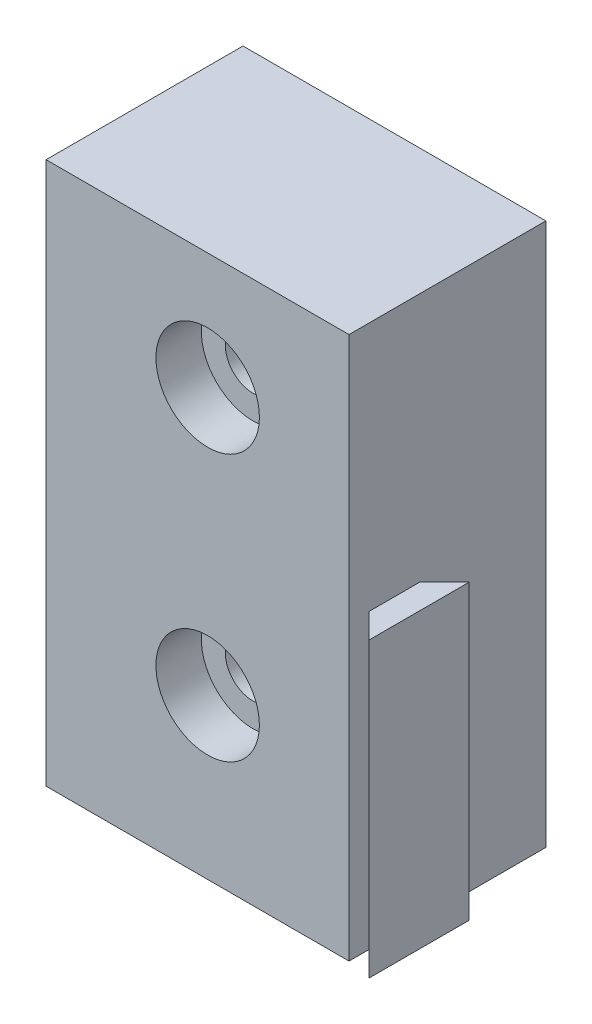
ISO-10303-21;
HEADER;
FILE_DESCRIPTION(('STEP AP214'),'2;1');
FILE_NAME('part.step','',(''),(''),'','','');
FILE_SCHEMA(('AUTOMOTIVE_DESIGN { 1 0 10303 214 1 1 1 1 }'));
ENDSEC;
DATA;
#1=APPLICATION_CONTEXT('core data for automotive mechanical design processes');
#2=APPLICATION_PROTOCOL_DEFINITION('international standard','automotive_design',2000,#1);
#3=PRODUCT_CONTEXT('',#1,'mechanical');
#4=PRODUCT('Part','Part','',(#3));
#5=PRODUCT_RELATED_PRODUCT_CATEGORY('part','',(#4));
#6=PRODUCT_DEFINITION_FORMATION('','',#4);
#7=PRODUCT_DEFINITION_CONTEXT('part definition',#1,'design');
#8=PRODUCT_DEFINITION('design','',#6,#7);
#9=PRODUCT_DEFINITION_SHAPE('','',#8);
#10=(LENGTH_UNIT() NAMED_UNIT(*) SI_UNIT(.MILLI.,.METRE.));
#11=(NAMED_UNIT(*) PLANE_ANGLE_UNIT() SI_UNIT($,.RADIAN.));
#12=(NAMED_UNIT(*) SI_UNIT($,.STERADIAN.) SOLID_ANGLE_UNIT());
#13=UNCERTAINTY_MEASURE_WITH_UNIT(LENGTH_MEASURE(1.E-05),#10,'distance_accuracy_value','');
#14=(GEOMETRIC_REPRESENTATION_CONTEXT(3) GLOBAL_UNCERTAINTY_ASSIGNED_CONTEXT((#13)) GLOBAL_UNIT_ASSIGNED_CONTEXT((#10,
#11,#12)) REPRESENTATION_CONTEXT('',''));
#15=CARTESIAN_POINT('',(0.,0.,0.));
#16=DIRECTION('',(0.,0.,1.));
#17=DIRECTION('',(1.,0.,0.));
#18=AXIS2_PLACEMENT_3D('',#15,#16,#17);
#19=CARTESIAN_POINT('',(0.,15.2522729151325,-63.4));
#20=DIRECTION('',(1.,0.,0.));
#21=DIRECTION('',(0.,0.,-1.));
#22=AXIS2_PLACEMENT_3D('',#19,#20,#21);
#23=PLANE('',#22);
#24=DIRECTION('',(0.,-1.,0.));
#25=VECTOR('',#24,1.);
#26=CARTESIAN_POINT('',(0.,29.,-45.8992173403571));
#27=LINE('',#26,#25);
#28=CARTESIAN_POINT('',(0.,29.,-45.8992173403571));
#29=VERTEX_POINT('',#28);
#30=CARTESIAN_POINT('',(0.,0.,-45.8992173403571));
#31=VERTEX_POINT('',#30);
#32=EDGE_CURVE('E195',#29,#31,#27,.T.);
#33=ORIENTED_EDGE('',*,*,#32,.F.);
#34=DIRECTION('',(0.,0.,1.));
#35=VECTOR('',#34,1.);
#36=CARTESIAN_POINT('',(0.,29.,-50.8992173403571));
#37=LINE('',#36,#35);
#38=CARTESIAN_POINT('',(0.,29.,-50.8992173403571));
#39=VERTEX_POINT('',#38);
#40=EDGE_CURVE('E199',#39,#29,#37,.T.);
#41=ORIENTED_EDGE('',*,*,#40,.F.);
#42=DIRECTION('',(0.,-1.,0.));
#43=VECTOR('',#42,1.);
#44=CARTESIAN_POINT('',(0.,29.,-50.8992173403571));
#45=LINE('',#44,#43);
#46=CARTESIAN_POINT('',(0.,0.,-50.8992173403571));
#47=VERTEX_POINT('',#46);
#48=EDGE_CURVE('E192',#39,#47,#45,.T.);
#49=ORIENTED_EDGE('',*,*,#48,.T.);
#50=DIRECTION('',(0.,0.,-1.));
#51=VECTOR('',#50,1.);
#52=CARTESIAN_POINT('',(0.,0.,0.));
#53=LINE('',#52,#51);
#54=CARTESIAN_POINT('',(0.,0.,-63.4));
#55=VERTEX_POINT('',#54);
#56=EDGE_CURVE('E123',#47,#55,#53,.T.);
#57=ORIENTED_EDGE('',*,*,#56,.T.);
#58=DIRECTION('',(0.,-1.,0.));
#59=VECTOR('',#58,1.);
#60=CARTESIAN_POINT('',(0.,0.,-63.4));
#61=LINE('',#60,#59);
#62=CARTESIAN_POINT('',(0.,53.7409284990673,-63.4));
#63=VERTEX_POINT('',#62);
#64=EDGE_CURVE('E113',#63,#55,#61,.T.);
#65=ORIENTED_EDGE('',*,*,#64,.F.);
#66=DIRECTION('',(0.,0.,-1.));
#67=VECTOR('',#66,1.);
#68=CARTESIAN_POINT('',(0.,53.7409284990673,-63.4));
#69=LINE('',#68,#67);
#70=CARTESIAN_POINT('',(0.,53.7409284990673,-43.8992173403571));
#71=VERTEX_POINT('',#70);
#72=EDGE_CURVE('E108',#71,#63,#69,.T.);
#73=ORIENTED_EDGE('',*,*,#72,.F.);
#74=DIRECTION('',(0.,1.,0.));
#75=VECTOR('',#74,1.);
#76=CARTESIAN_POINT('',(0.,0.,-43.8992173403571));
#77=LINE('',#76,#75);
#78=CARTESIAN_POINT('',(0.,0.,-43.8992173403571));
#79=VERTEX_POINT('',#78);
#80=EDGE_CURVE('E66',#79,#71,#77,.T.);
#81=ORIENTED_EDGE('',*,*,#80,.F.);
#82=EDGE_CURVE('E43',#79,#31,#53,.T.);
#83=ORIENTED_EDGE('',*,*,#82,.T.);
#84=EDGE_LOOP('',(#33,#41,#49,#57,#65,#73,#81,#83));
#85=FACE_BOUND('',#84,.T.);
#86=ADVANCED_FACE('F39',(#85),#23,.T.);
#87=CARTESIAN_POINT('',(61.2,0.,0.));
#88=DIRECTION('',(0.,1.,0.));
#89=DIRECTION('',(0.,0.,1.));
#90=AXIS2_PLACEMENT_3D('',#87,#88,#89);
#91=PLANE('',#90);
#92=ORIENTED_EDGE('',*,*,#82,.F.);
#93=DIRECTION('',(1.,0.,0.));
#94=VECTOR('',#93,1.);
#95=CARTESIAN_POINT('',(-30.,0.,-43.8992173403571));
#96=LINE('',#95,#94);
#97=CARTESIAN_POINT('',(-30.,0.,-43.8992173403571));
#98=VERTEX_POINT('',#97);
#99=EDGE_CURVE('E93',#98,#79,#96,.T.);
#100=ORIENTED_EDGE('',*,*,#99,.F.);
#101=DIRECTION('',(0.,0.,1.));
#102=VECTOR('',#101,1.);
#103=CARTESIAN_POINT('',(-30.,0.,-63.4));
#104=LINE('',#103,#102);
#105=CARTESIAN_POINT('',(-30.,0.,-63.4));
#106=VERTEX_POINT('',#105);
#107=EDGE_CURVE('E86',#106,#98,#104,.T.);
#108=ORIENTED_EDGE('',*,*,#107,.F.);
#109=DIRECTION('',(1.,0.,0.));
#110=VECTOR('',#109,1.);
#111=CARTESIAN_POINT('',(-30.,0.,-63.4));
#112=LINE('',#111,#110);
#113=EDGE_CURVE('E92',#106,#55,#112,.T.);
#114=ORIENTED_EDGE('',*,*,#113,.T.);
#115=ORIENTED_EDGE('',*,*,#56,.F.);
#116=DIRECTION('',(-0.707106781186544,0.,0.707106781186551));
#117=VECTOR('',#116,1.);
#118=CARTESIAN_POINT('',(2.44999999999999,0.,-53.3492173403571));
#119=LINE('',#118,#117);
#120=CARTESIAN_POINT('',(2.44999999999999,0.,-53.3492173403571));
#121=VERTEX_POINT('',#120);
#122=EDGE_CURVE('E57',#121,#47,#119,.T.);
#123=ORIENTED_EDGE('',*,*,#122,.F.);
#124=DIRECTION('',(0.,0.,-1.));
#125=VECTOR('',#124,1.);
#126=CARTESIAN_POINT('',(2.44999999999999,0.,-43.4492173403571));
#127=LINE('',#126,#125);
#128=CARTESIAN_POINT('',(2.44999999999999,0.,-43.4492173403571));
#129=VERTEX_POINT('',#128);
#130=EDGE_CURVE('E203',#129,#121,#127,.T.);
#131=ORIENTED_EDGE('',*,*,#130,.F.);
#132=DIRECTION('',(0.707106781186548,0.,0.707106781186547));
#133=VECTOR('',#132,1.);
#134=CARTESIAN_POINT('',(0.,0.,-45.8992173403571));
#135=LINE('',#134,#133);
#136=EDGE_CURVE('E207',#31,#129,#135,.T.);
#137=ORIENTED_EDGE('',*,*,#136,.F.);
#138=EDGE_LOOP('',(#92,#100,#108,#114,#115,#123,#131,#137));
#139=FACE_BOUND('',#138,.T.);
#140=ADVANCED_FACE('F41',(#139),#91,.F.);
#141=CARTESIAN_POINT('',(-14.,15.8,-36.121042747305));
#142=DIRECTION('',(0.,0.,-1.));
#143=DIRECTION('',(-1.,0.,0.));
#144=AXIS2_PLACEMENT_3D('',#141,#142,#143);
#145=CYLINDRICAL_SURFACE('',#144,2.75000000000001);
#146=CARTESIAN_POINT('',(-14.,15.8,-58.9));
#147=DIRECTION('',(0.,0.,-1.));
#148=DIRECTION('',(-1.,0.,0.));
#149=AXIS2_PLACEMENT_3D('',#146,#147,#148);
#150=CIRCLE('',#149,2.75000000000001);
#151=CARTESIAN_POINT('',(-16.75,15.8,-58.9));
#152=VERTEX_POINT('',#151);
#153=EDGE_CURVE('E170',#152,#152,#150,.F.);
#154=ORIENTED_EDGE('',*,*,#153,.F.);
#155=EDGE_LOOP('',(#154));
#156=FACE_BOUND('',#155,.T.);
#157=CARTESIAN_POINT('',(-14.,15.8,-48.3992173403571));
#158=DIRECTION('',(0.,0.,1.));
#159=DIRECTION('',(1.,0.,0.));
#160=AXIS2_PLACEMENT_3D('',#157,#158,#159);
#161=CIRCLE('',#160,2.75000000000001);
#162=CARTESIAN_POINT('',(-11.25,15.8,-48.3992173403571));
#163=VERTEX_POINT('',#162);
#164=EDGE_CURVE('E143',#163,#163,#161,.F.);
#165=ORIENTED_EDGE('',*,*,#164,.F.);
#166=EDGE_LOOP('',(#165));
#167=FACE_BOUND('',#166,.T.);
#168=ADVANCED_FACE('F293',(#156,#167),#145,.F.);
#169=CARTESIAN_POINT('',(-14.,42.2,-36.121042747305));
#170=DIRECTION('',(0.,0.,-1.));
#171=DIRECTION('',(-1.,0.,0.));
#172=AXIS2_PLACEMENT_3D('',#169,#170,#171);
#173=CYLINDRICAL_SURFACE('',#172,2.75000000000001);
#174=CARTESIAN_POINT('',(-14.,42.2,-58.9));
#175=DIRECTION('',(0.,0.,-1.));
#176=DIRECTION('',(-1.,0.,0.));
#177=AXIS2_PLACEMENT_3D('',#174,#175,#176);
#178=CIRCLE('',#177,2.75000000000001);
#179=CARTESIAN_POINT('',(-16.75,42.2,-58.9));
#180=VERTEX_POINT('',#179);
#181=EDGE_CURVE('E125',#180,#180,#178,.F.);
#182=ORIENTED_EDGE('',*,*,#181,.F.);
#183=EDGE_LOOP('',(#182));
#184=FACE_BOUND('',#183,.T.);
#185=CARTESIAN_POINT('',(-14.,42.2,-48.3992173403571));
#186=DIRECTION('',(0.,0.,1.));
#187=DIRECTION('',(1.,0.,0.));
#188=AXIS2_PLACEMENT_3D('',#185,#186,#187);
#189=CIRCLE('',#188,2.75000000000001);
#190=CARTESIAN_POINT('',(-11.25,42.2,-48.3992173403571));
#191=VERTEX_POINT('',#190);
#192=EDGE_CURVE('E167',#191,#191,#189,.F.);
#193=ORIENTED_EDGE('',*,*,#192,.F.);
#194=EDGE_LOOP('',(#193));
#195=FACE_BOUND('',#194,.T.);
#196=ADVANCED_FACE('F298',(#184,#195),#173,.F.);
#197=CARTESIAN_POINT('',(-30.,0.,-63.4));
#198=DIRECTION('',(0.,0.,1.));
#199=DIRECTION('',(1.,0.,0.));
#200=AXIS2_PLACEMENT_3D('',#197,#198,#199);
#201=PLANE('',#200);
#202=CARTESIAN_POINT('',(-14.,15.8,-63.4));
#203=DIRECTION('',(0.,0.,-1.));
#204=DIRECTION('',(-1.,0.,0.));
#205=AXIS2_PLACEMENT_3D('',#202,#203,#204);
#206=CIRCLE('',#205,5.125);
#207=CARTESIAN_POINT('',(-19.125,15.8,-63.4));
#208=VERTEX_POINT('',#207);
#209=EDGE_CURVE('E148',#208,#208,#206,.T.);
#210=ORIENTED_EDGE('',*,*,#209,.F.);
#211=EDGE_LOOP('',(#210));
#212=FACE_BOUND('',#211,.T.);
#213=CARTESIAN_POINT('',(-14.,42.2,-63.4));
#214=DIRECTION('',(0.,0.,-1.));
#215=DIRECTION('',(-1.,0.,0.));
#216=AXIS2_PLACEMENT_3D('',#213,#214,#215);
#217=CIRCLE('',#216,5.125);
#218=CARTESIAN_POINT('',(-19.125,42.2,-63.4));
#219=VERTEX_POINT('',#218);
#220=EDGE_CURVE('E139',#219,#219,#217,.T.);
#221=ORIENTED_EDGE('',*,*,#220,.F.);
#222=EDGE_LOOP('',(#221));
#223=FACE_BOUND('',#222,.T.);
#224=ORIENTED_EDGE('',*,*,#64,.T.);
#225=ORIENTED_EDGE('',*,*,#113,.F.);
#226=DIRECTION('',(0.,-1.,0.));
#227=VECTOR('',#226,1.);
#228=CARTESIAN_POINT('',(-30.,0.,-63.4));
#229=LINE('',#228,#227);
#230=CARTESIAN_POINT('',(-30.,53.7409284990673,-63.4));
#231=VERTEX_POINT('',#230);
#232=EDGE_CURVE('E97',#231,#106,#229,.T.);
#233=ORIENTED_EDGE('',*,*,#232,.F.);
#234=DIRECTION('',(1.,0.,0.));
#235=VECTOR('',#234,1.);
#236=CARTESIAN_POINT('',(-30.,53.7409284990673,-63.4));
#237=LINE('',#236,#235);
#238=EDGE_CURVE('E130',#231,#63,#237,.T.);
#239=ORIENTED_EDGE('',*,*,#238,.T.);
#240=EDGE_LOOP('',(#224,#225,#233,#239));
#241=FACE_BOUND('',#240,.T.);
#242=ADVANCED_FACE('F111',(#212,#223,#241),#201,.F.);
#243=CARTESIAN_POINT('',(-30.,0.,-43.8992173403571));
#244=DIRECTION('',(0.,0.,-1.));
#245=DIRECTION('',(-1.,0.,0.));
#246=AXIS2_PLACEMENT_3D('',#243,#244,#245);
#247=PLANE('',#246);
#248=CARTESIAN_POINT('',(-14.,42.2,-43.8992173403571));
#249=DIRECTION('',(0.,0.,1.));
#250=DIRECTION('',(1.,0.,0.));
#251=AXIS2_PLACEMENT_3D('',#248,#249,#250);
#252=CIRCLE('',#251,5.125);
#253=CARTESIAN_POINT('',(-8.875,42.2,-43.8992173403571));
#254=VERTEX_POINT('',#253);
#255=EDGE_CURVE('E159',#254,#254,#252,.T.);
#256=ORIENTED_EDGE('',*,*,#255,.F.);
#257=EDGE_LOOP('',(#256));
#258=FACE_BOUND('',#257,.T.);
#259=CARTESIAN_POINT('',(-14.,15.8,-43.8992173403571));
#260=DIRECTION('',(0.,0.,1.));
#261=DIRECTION('',(1.,0.,0.));
#262=AXIS2_PLACEMENT_3D('',#259,#260,#261);
#263=CIRCLE('',#262,5.125);
#264=CARTESIAN_POINT('',(-8.875,15.8,-43.8992173403571));
#265=VERTEX_POINT('',#264);
#266=EDGE_CURVE('E11',#265,#265,#263,.T.);
#267=ORIENTED_EDGE('',*,*,#266,.F.);
#268=EDGE_LOOP('',(#267));
#269=FACE_BOUND('',#268,.T.);
#270=ORIENTED_EDGE('',*,*,#99,.T.);
#271=ORIENTED_EDGE('',*,*,#80,.T.);
#272=DIRECTION('',(1.,0.,0.));
#273=VECTOR('',#272,1.);
#274=CARTESIAN_POINT('',(-30.,53.7409284990673,-43.8992173403571));
#275=LINE('',#274,#273);
#276=CARTESIAN_POINT('',(-30.,53.7409284990673,-43.8992173403571));
#277=VERTEX_POINT('',#276);
#278=EDGE_CURVE('E119',#277,#71,#275,.T.);
#279=ORIENTED_EDGE('',*,*,#278,.F.);
#280=DIRECTION('',(0.,1.,0.));
#281=VECTOR('',#280,1.);
#282=CARTESIAN_POINT('',(-30.,0.,-43.8992173403571));
#283=LINE('',#282,#281);
#284=EDGE_CURVE('E98',#98,#277,#283,.T.);
#285=ORIENTED_EDGE('',*,*,#284,.F.);
#286=EDGE_LOOP('',(#270,#271,#279,#285));
#287=FACE_BOUND('',#286,.T.);
#288=ADVANCED_FACE('F255',(#258,#269,#287),#247,.F.);
#289=CARTESIAN_POINT('',(-30.,53.7409284990673,-63.4));
#290=DIRECTION('',(0.,-1.,0.));
#291=DIRECTION('',(0.,0.,-1.));
#292=AXIS2_PLACEMENT_3D('',#289,#290,#291);
#293=PLANE('',#292);
#294=ORIENTED_EDGE('',*,*,#72,.T.);
#295=ORIENTED_EDGE('',*,*,#238,.F.);
#296=DIRECTION('',(0.,0.,-1.));
#297=VECTOR('',#296,1.);
#298=CARTESIAN_POINT('',(-30.,53.7409284990673,-63.4));
#299=LINE('',#298,#297);
#300=EDGE_CURVE('E103',#277,#231,#299,.T.);
#301=ORIENTED_EDGE('',*,*,#300,.F.);
#302=ORIENTED_EDGE('',*,*,#278,.T.);
#303=EDGE_LOOP('',(#294,#295,#301,#302));
#304=FACE_BOUND('',#303,.T.);
#305=ADVANCED_FACE('F257',(#304),#293,.F.);
#306=CARTESIAN_POINT('',(-30.,0.,0.));
#307=DIRECTION('',(1.,0.,0.));
#308=DIRECTION('',(0.,0.,-1.));
#309=AXIS2_PLACEMENT_3D('',#306,#307,#308);
#310=PLANE('',#309);
#311=ORIENTED_EDGE('',*,*,#232,.T.);
#312=ORIENTED_EDGE('',*,*,#107,.T.);
#313=ORIENTED_EDGE('',*,*,#284,.T.);
#314=ORIENTED_EDGE('',*,*,#300,.T.);
#315=EDGE_LOOP('',(#311,#312,#313,#314));
#316=FACE_BOUND('',#315,.T.);
#317=ADVANCED_FACE('F101',(#316),#310,.F.);
#318=CARTESIAN_POINT('',(-14.,42.2,-58.9));
#319=DIRECTION('',(0.,0.,-1.));
#320=DIRECTION('',(-1.,0.,0.));
#321=AXIS2_PLACEMENT_3D('',#318,#319,#320);
#322=PLANE('',#321);
#323=CARTESIAN_POINT('',(-14.,42.2,-58.9));
#324=DIRECTION('',(0.,0.,-1.));
#325=DIRECTION('',(-1.,0.,0.));
#326=AXIS2_PLACEMENT_3D('',#323,#324,#325);
#327=CIRCLE('',#326,5.125);
#328=CARTESIAN_POINT('',(-19.125,42.2,-58.9));
#329=VERTEX_POINT('',#328);
#330=EDGE_CURVE('E144',#329,#329,#327,.T.);
#331=ORIENTED_EDGE('',*,*,#330,.T.);
#332=EDGE_LOOP('',(#331));
#333=FACE_BOUND('',#332,.T.);
#334=ORIENTED_EDGE('',*,*,#181,.T.);
#335=EDGE_LOOP('',(#334));
#336=FACE_BOUND('',#335,.T.);
#337=ADVANCED_FACE('F335',(#333,#336),#322,.T.);
#338=CARTESIAN_POINT('',(-14.,42.2,-58.9));
#339=DIRECTION('',(0.,0.,-1.));
#340=DIRECTION('',(-1.,0.,0.));
#341=AXIS2_PLACEMENT_3D('',#338,#339,#340);
#342=CYLINDRICAL_SURFACE('',#341,5.125);
#343=ORIENTED_EDGE('',*,*,#330,.F.);
#344=EDGE_LOOP('',(#343));
#345=FACE_BOUND('',#344,.T.);
#346=ORIENTED_EDGE('',*,*,#220,.T.);
#347=EDGE_LOOP('',(#346));
#348=FACE_BOUND('',#347,.T.);
#349=ADVANCED_FACE('F330',(#345,#348),#342,.F.);
#350=CARTESIAN_POINT('',(-14.,15.8,-58.9));
#351=DIRECTION('',(0.,0.,-1.));
#352=DIRECTION('',(-1.,0.,0.));
#353=AXIS2_PLACEMENT_3D('',#350,#351,#352);
#354=PLANE('',#353);
#355=CARTESIAN_POINT('',(-14.,15.8,-58.9));
#356=DIRECTION('',(0.,0.,-1.));
#357=DIRECTION('',(-1.,0.,0.));
#358=AXIS2_PLACEMENT_3D('',#355,#356,#357);
#359=CIRCLE('',#358,5.125);
#360=CARTESIAN_POINT('',(-19.125,15.8,-58.9));
#361=VERTEX_POINT('',#360);
#362=EDGE_CURVE('E152',#361,#361,#359,.T.);
#363=ORIENTED_EDGE('',*,*,#362,.T.);
#364=EDGE_LOOP('',(#363));
#365=FACE_BOUND('',#364,.T.);
#366=ORIENTED_EDGE('',*,*,#153,.T.);
#367=EDGE_LOOP('',(#366));
#368=FACE_BOUND('',#367,.T.);
#369=ADVANCED_FACE('F327',(#365,#368),#354,.T.);
#370=CARTESIAN_POINT('',(-14.,15.8,-58.9));
#371=DIRECTION('',(0.,0.,-1.));
#372=DIRECTION('',(-1.,0.,0.));
#373=AXIS2_PLACEMENT_3D('',#370,#371,#372);
#374=CYLINDRICAL_SURFACE('',#373,5.125);
#375=ORIENTED_EDGE('',*,*,#362,.F.);
#376=EDGE_LOOP('',(#375));
#377=FACE_BOUND('',#376,.T.);
#378=ORIENTED_EDGE('',*,*,#209,.T.);
#379=EDGE_LOOP('',(#378));
#380=FACE_BOUND('',#379,.T.);
#381=ADVANCED_FACE('F322',(#377,#380),#374,.F.);
#382=CARTESIAN_POINT('',(-14.,15.8,-48.3992173403571));
#383=DIRECTION('',(0.,0.,1.));
#384=DIRECTION('',(1.,0.,0.));
#385=AXIS2_PLACEMENT_3D('',#382,#383,#384);
#386=PLANE('',#385);
#387=CARTESIAN_POINT('',(-14.,15.8,-48.3992173403571));
#388=DIRECTION('',(0.,0.,1.));
#389=DIRECTION('',(1.,0.,0.));
#390=AXIS2_PLACEMENT_3D('',#387,#388,#389);
#391=CIRCLE('',#390,5.125);
#392=CARTESIAN_POINT('',(-8.875,15.8,-48.3992173403571));
#393=VERTEX_POINT('',#392);
#394=EDGE_CURVE('E49',#393,#393,#391,.T.);
#395=ORIENTED_EDGE('',*,*,#394,.T.);
#396=EDGE_LOOP('',(#395));
#397=FACE_BOUND('',#396,.T.);
#398=ORIENTED_EDGE('',*,*,#164,.T.);
#399=EDGE_LOOP('',(#398));
#400=FACE_BOUND('',#399,.T.);
#401=ADVANCED_FACE('F319',(#397,#400),#386,.T.);
#402=CARTESIAN_POINT('',(-14.,15.8,-48.3992173403571));
#403=DIRECTION('',(0.,0.,1.));
#404=DIRECTION('',(1.,0.,0.));
#405=AXIS2_PLACEMENT_3D('',#402,#403,#404);
#406=CYLINDRICAL_SURFACE('',#405,5.125);
#407=ORIENTED_EDGE('',*,*,#394,.F.);
#408=EDGE_LOOP('',(#407));
#409=FACE_BOUND('',#408,.T.);
#410=ORIENTED_EDGE('',*,*,#266,.T.);
#411=EDGE_LOOP('',(#410));
#412=FACE_BOUND('',#411,.T.);
#413=ADVANCED_FACE('F314',(#409,#412),#406,.F.);
#414=CARTESIAN_POINT('',(-14.,42.2,-48.3992173403571));
#415=DIRECTION('',(0.,0.,1.));
#416=DIRECTION('',(1.,0.,0.));
#417=AXIS2_PLACEMENT_3D('',#414,#415,#416);
#418=PLANE('',#417);
#419=CARTESIAN_POINT('',(-14.,42.2,-48.3992173403571));
#420=DIRECTION('',(0.,0.,1.));
#421=DIRECTION('',(1.,0.,0.));
#422=AXIS2_PLACEMENT_3D('',#419,#420,#421);
#423=CIRCLE('',#422,5.125);
#424=CARTESIAN_POINT('',(-8.875,42.2,-48.3992173403571));
#425=VERTEX_POINT('',#424);
#426=EDGE_CURVE('E163',#425,#425,#423,.T.);
#427=ORIENTED_EDGE('',*,*,#426,.T.);
#428=EDGE_LOOP('',(#427));
#429=FACE_BOUND('',#428,.T.);
#430=ORIENTED_EDGE('',*,*,#192,.T.);
#431=EDGE_LOOP('',(#430));
#432=FACE_BOUND('',#431,.T.);
#433=ADVANCED_FACE('F308',(#429,#432),#418,.T.);
#434=CARTESIAN_POINT('',(-14.,42.2,-48.3992173403571));
#435=DIRECTION('',(0.,0.,1.));
#436=DIRECTION('',(1.,0.,0.));
#437=AXIS2_PLACEMENT_3D('',#434,#435,#436);
#438=CYLINDRICAL_SURFACE('',#437,5.125);
#439=ORIENTED_EDGE('',*,*,#426,.F.);
#440=EDGE_LOOP('',(#439));
#441=FACE_BOUND('',#440,.T.);
#442=ORIENTED_EDGE('',*,*,#255,.T.);
#443=EDGE_LOOP('',(#442));
#444=FACE_BOUND('',#443,.T.);
#445=ADVANCED_FACE('F301',(#441,#444),#438,.F.);
#446=CARTESIAN_POINT('',(0.,29.,-45.8992173403571));
#447=DIRECTION('',(0.707106781186547,0.,-0.707106781186548));
#448=DIRECTION('',(-0.707106781186548,0.,-0.707106781186547));
#449=AXIS2_PLACEMENT_3D('',#446,#447,#448);
#450=PLANE('',#449);
#451=ORIENTED_EDGE('',*,*,#136,.T.);
#452=DIRECTION('',(0.,-1.,0.));
#453=VECTOR('',#452,1.);
#454=CARTESIAN_POINT('',(2.44999999999999,29.,-43.4492173403571));
#455=LINE('',#454,#453);
#456=CARTESIAN_POINT('',(2.44999999999999,29.,-43.4492173403571));
#457=VERTEX_POINT('',#456);
#458=EDGE_CURVE('E185',#457,#129,#455,.T.);
#459=ORIENTED_EDGE('',*,*,#458,.F.);
#460=DIRECTION('',(0.707106781186548,0.,0.707106781186547));
#461=VECTOR('',#460,1.);
#462=CARTESIAN_POINT('',(0.,29.,-45.8992173403571));
#463=LINE('',#462,#461);
#464=EDGE_CURVE('E202',#29,#457,#463,.T.);
#465=ORIENTED_EDGE('',*,*,#464,.F.);
#466=ORIENTED_EDGE('',*,*,#32,.T.);
#467=EDGE_LOOP('',(#451,#459,#465,#466));
#468=FACE_BOUND('',#467,.T.);
#469=ADVANCED_FACE('F239',(#468),#450,.F.);
#470=CARTESIAN_POINT('',(2.44999999999999,29.,-43.4492173403571));
#471=DIRECTION('',(-1.,0.,0.));
#472=DIRECTION('',(0.,0.,1.));
#473=AXIS2_PLACEMENT_3D('',#470,#471,#472);
#474=PLANE('',#473);
#475=ORIENTED_EDGE('',*,*,#130,.T.);
#476=DIRECTION('',(0.,-1.,0.));
#477=VECTOR('',#476,1.);
#478=CARTESIAN_POINT('',(2.44999999999999,29.,-53.3492173403571));
#479=LINE('',#478,#477);
#480=CARTESIAN_POINT('',(2.44999999999999,29.,-53.3492173403571));
#481=VERTEX_POINT('',#480);
#482=EDGE_CURVE('E189',#481,#121,#479,.T.);
#483=ORIENTED_EDGE('',*,*,#482,.F.);
#484=DIRECTION('',(0.,0.,-1.));
#485=VECTOR('',#484,1.);
#486=CARTESIAN_POINT('',(2.44999999999999,29.,-43.4492173403571));
#487=LINE('',#486,#485);
#488=EDGE_CURVE('E218',#457,#481,#487,.T.);
#489=ORIENTED_EDGE('',*,*,#488,.F.);
#490=ORIENTED_EDGE('',*,*,#458,.T.);
#491=EDGE_LOOP('',(#475,#483,#489,#490));
#492=FACE_BOUND('',#491,.T.);
#493=ADVANCED_FACE('F243',(#492),#474,.F.);
#494=CARTESIAN_POINT('',(2.44999999999999,29.,-53.3492173403571));
#495=DIRECTION('',(0.707106781186551,0.,0.707106781186544));
#496=DIRECTION('',(0.707106781186544,0.,-0.707106781186551));
#497=AXIS2_PLACEMENT_3D('',#494,#495,#496);
#498=PLANE('',#497);
#499=ORIENTED_EDGE('',*,*,#122,.T.);
#500=ORIENTED_EDGE('',*,*,#48,.F.);
#501=DIRECTION('',(-0.707106781186544,0.,0.707106781186551));
#502=VECTOR('',#501,1.);
#503=CARTESIAN_POINT('',(2.44999999999999,29.,-53.3492173403571));
#504=LINE('',#503,#502);
#505=EDGE_CURVE('E214',#481,#39,#504,.T.);
#506=ORIENTED_EDGE('',*,*,#505,.F.);
#507=ORIENTED_EDGE('',*,*,#482,.T.);
#508=EDGE_LOOP('',(#499,#500,#506,#507));
#509=FACE_BOUND('',#508,.T.);
#510=ADVANCED_FACE('F282',(#509),#498,.F.);
#511=CARTESIAN_POINT('',(0.,29.,0.));
#512=DIRECTION('',(0.,-1.,0.));
#513=DIRECTION('',(0.,0.,-1.));
#514=AXIS2_PLACEMENT_3D('',#511,#512,#513);
#515=PLANE('',#514);
#516=ORIENTED_EDGE('',*,*,#464,.T.);
#517=ORIENTED_EDGE('',*,*,#488,.T.);
#518=ORIENTED_EDGE('',*,*,#505,.T.);
#519=ORIENTED_EDGE('',*,*,#40,.T.);
#520=EDGE_LOOP('',(#516,#517,#518,#519));
#521=FACE_BOUND('',#520,.T.);
#522=ADVANCED_FACE('F229',(#521),#515,.F.);
#523=CLOSED_SHELL('',(#86,#140,#168,#196,#242,#288,#305,#317,#337,#349,#369,#381,#401,#413,#433,
#445,#469,#493,#510,#522));
#524=MANIFOLD_SOLID_BREP('B2',#523);
#525=ADVANCED_BREP_SHAPE_REPRESENTATION('',(#18,#524),#14);
#526=SHAPE_DEFINITION_REPRESENTATION(#9,#525);
ENDSEC;
END-ISO-10303-21;
